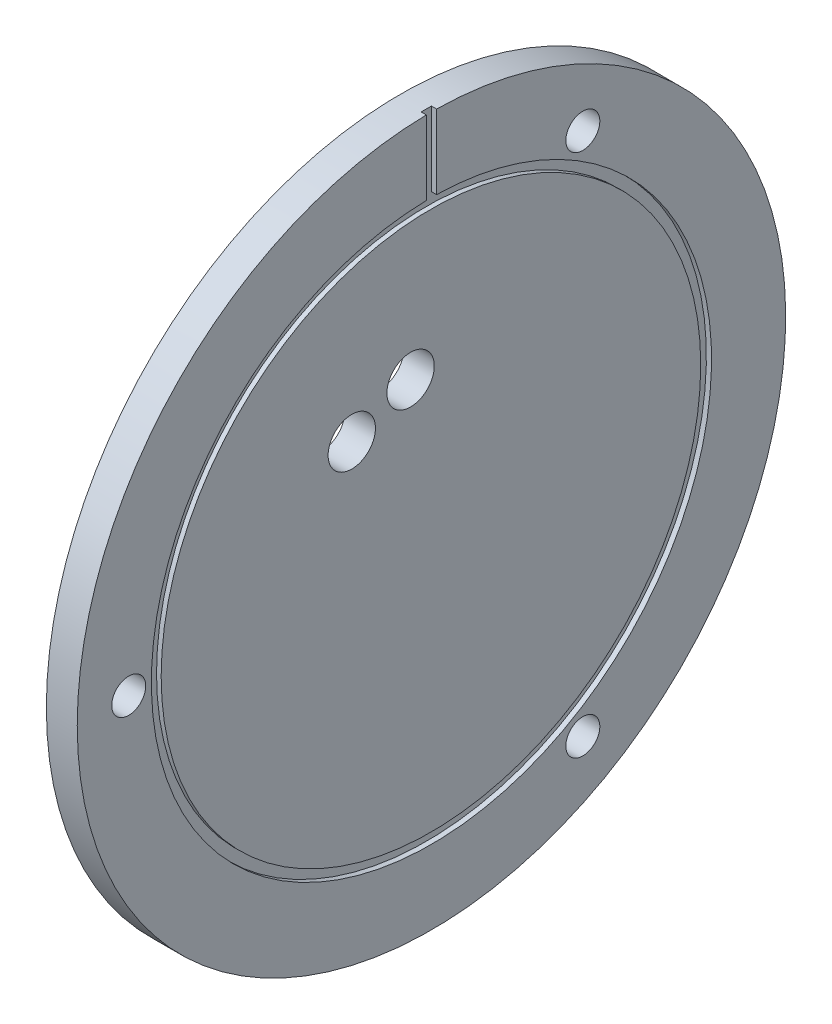
ISO-10303-21;
HEADER;
FILE_DESCRIPTION(('STEP AP214'),'2;1');
FILE_NAME('part.step','',(''),(''),'','','');
FILE_SCHEMA(('AUTOMOTIVE_DESIGN { 1 0 10303 214 1 1 1 1 }'));
ENDSEC;
DATA;
#1=APPLICATION_CONTEXT('core data for automotive mechanical design processes');
#2=APPLICATION_PROTOCOL_DEFINITION('international standard','automotive_design',2000,#1);
#3=PRODUCT_CONTEXT('',#1,'mechanical');
#4=PRODUCT('Part','Part','',(#3));
#5=PRODUCT_RELATED_PRODUCT_CATEGORY('part','',(#4));
#6=PRODUCT_DEFINITION_FORMATION('','',#4);
#7=PRODUCT_DEFINITION_CONTEXT('part definition',#1,'design');
#8=PRODUCT_DEFINITION('design','',#6,#7);
#9=PRODUCT_DEFINITION_SHAPE('','',#8);
#10=(LENGTH_UNIT() NAMED_UNIT(*) SI_UNIT(.MILLI.,.METRE.));
#11=(NAMED_UNIT(*) PLANE_ANGLE_UNIT() SI_UNIT($,.RADIAN.));
#12=(NAMED_UNIT(*) SI_UNIT($,.STERADIAN.) SOLID_ANGLE_UNIT());
#13=UNCERTAINTY_MEASURE_WITH_UNIT(LENGTH_MEASURE(1.E-05),#10,'distance_accuracy_value','');
#14=(GEOMETRIC_REPRESENTATION_CONTEXT(3) GLOBAL_UNCERTAINTY_ASSIGNED_CONTEXT((#13)) GLOBAL_UNIT_ASSIGNED_CONTEXT((#10,
#11,#12)) REPRESENTATION_CONTEXT('',''));
#15=CARTESIAN_POINT('',(0.,0.,0.));
#16=DIRECTION('',(0.,0.,1.));
#17=DIRECTION('',(1.,0.,0.));
#18=AXIS2_PLACEMENT_3D('',#15,#16,#17);
#19=CARTESIAN_POINT('',(-110.,0.,0.));
#20=DIRECTION('',(-1.,0.,0.));
#21=DIRECTION('',(0.,0.,1.));
#22=AXIS2_PLACEMENT_3D('',#19,#20,#21);
#23=CYLINDRICAL_SURFACE('',#22,27.2);
#24=DIRECTION('',(-1.,0.,0.));
#25=VECTOR('',#24,1.);
#26=CARTESIAN_POINT('',(-110.,27.1954040234743,-0.5));
#27=LINE('',#26,#25);
#28=CARTESIAN_POINT('',(159.2,27.1954040234743,-0.5));
#29=VERTEX_POINT('',#28);
#30=CARTESIAN_POINT('',(159.7,27.1954040234743,-0.5));
#31=VERTEX_POINT('',#30);
#32=EDGE_CURVE('E131',#29,#31,#27,.F.);
#33=ORIENTED_EDGE('',*,*,#32,.F.);
#34=CARTESIAN_POINT('',(159.2,0.,0.));
#35=DIRECTION('',(-1.,0.,0.));
#36=DIRECTION('',(0.,0.,1.));
#37=AXIS2_PLACEMENT_3D('',#34,#35,#36);
#38=CIRCLE('',#37,27.2);
#39=CARTESIAN_POINT('',(159.2,27.1954040234743,0.5));
#40=VERTEX_POINT('',#39);
#41=EDGE_CURVE('E105',#29,#40,#38,.T.);
#42=ORIENTED_EDGE('',*,*,#41,.T.);
#43=DIRECTION('',(-1.,0.,0.));
#44=VECTOR('',#43,1.);
#45=CARTESIAN_POINT('',(-110.,27.1954040234743,0.5));
#46=LINE('',#45,#44);
#47=CARTESIAN_POINT('',(159.7,27.1954040234743,0.5));
#48=VERTEX_POINT('',#47);
#49=EDGE_CURVE('E83',#48,#40,#46,.T.);
#50=ORIENTED_EDGE('',*,*,#49,.F.);
#51=CARTESIAN_POINT('',(159.7,0.,0.));
#52=DIRECTION('',(-1.,0.,0.));
#53=DIRECTION('',(0.,0.,1.));
#54=AXIS2_PLACEMENT_3D('',#51,#52,#53);
#55=CIRCLE('',#54,27.2);
#56=EDGE_CURVE('E107',#31,#48,#55,.T.);
#57=ORIENTED_EDGE('',*,*,#56,.F.);
#58=EDGE_LOOP('',(#33,#42,#50,#57));
#59=FACE_BOUND('',#58,.T.);
#60=ADVANCED_FACE('F33',(#59),#23,.F.);
#61=CARTESIAN_POINT('',(159.7,27.2,0.));
#62=DIRECTION('',(-1.,0.,0.));
#63=DIRECTION('',(0.,0.,1.));
#64=AXIS2_PLACEMENT_3D('',#61,#62,#63);
#65=PLANE('',#64);
#66=CARTESIAN_POINT('',(159.7,0.,29.4));
#67=DIRECTION('',(1.,0.,0.));
#68=DIRECTION('',(0.,0.,-1.));
#69=AXIS2_PLACEMENT_3D('',#66,#67,#68);
#70=CIRCLE('',#69,1.65);
#71=CARTESIAN_POINT('',(159.7,0.,27.75));
#72=VERTEX_POINT('',#71);
#73=EDGE_CURVE('E126',#72,#72,#70,.T.);
#74=ORIENTED_EDGE('',*,*,#73,.F.);
#75=EDGE_LOOP('',(#74));
#76=FACE_BOUND('',#75,.T.);
#77=CARTESIAN_POINT('',(159.7,-25.4611468712625,-14.7));
#78=DIRECTION('',(1.,0.,0.));
#79=DIRECTION('',(0.,0.,-1.));
#80=AXIS2_PLACEMENT_3D('',#77,#78,#79);
#81=CIRCLE('',#80,1.65);
#82=CARTESIAN_POINT('',(159.7,-25.4611468712625,-16.35));
#83=VERTEX_POINT('',#82);
#84=EDGE_CURVE('E130',#83,#83,#81,.T.);
#85=ORIENTED_EDGE('',*,*,#84,.F.);
#86=EDGE_LOOP('',(#85));
#87=FACE_BOUND('',#86,.T.);
#88=CARTESIAN_POINT('',(159.7,25.4611468712625,-14.7));
#89=DIRECTION('',(1.,0.,0.));
#90=DIRECTION('',(0.,0.,-1.));
#91=AXIS2_PLACEMENT_3D('',#88,#89,#90);
#92=CIRCLE('',#91,1.65);
#93=CARTESIAN_POINT('',(159.7,25.4611468712625,-16.35));
#94=VERTEX_POINT('',#93);
#95=EDGE_CURVE('E127',#94,#94,#92,.T.);
#96=ORIENTED_EDGE('',*,*,#95,.F.);
#97=EDGE_LOOP('',(#96));
#98=FACE_BOUND('',#97,.T.);
#99=DIRECTION('',(0.,1.,0.));
#100=VECTOR('',#99,1.);
#101=CARTESIAN_POINT('',(159.7,26.2,-0.5));
#102=LINE('',#101,#100);
#103=CARTESIAN_POINT('',(159.7,34.3963660871319,-0.5));
#104=VERTEX_POINT('',#103);
#105=EDGE_CURVE('E84',#31,#104,#102,.T.);
#106=ORIENTED_EDGE('',*,*,#105,.F.);
#107=ORIENTED_EDGE('',*,*,#56,.T.);
#108=DIRECTION('',(0.,-1.,0.));
#109=VECTOR('',#108,1.);
#110=CARTESIAN_POINT('',(159.7,35.,0.5));
#111=LINE('',#110,#109);
#112=CARTESIAN_POINT('',(159.7,34.3963660871319,0.5));
#113=VERTEX_POINT('',#112);
#114=EDGE_CURVE('E55',#113,#48,#111,.T.);
#115=ORIENTED_EDGE('',*,*,#114,.F.);
#116=CARTESIAN_POINT('',(159.7,0.,0.));
#117=DIRECTION('',(-1.,0.,0.));
#118=DIRECTION('',(0.,0.,1.));
#119=AXIS2_PLACEMENT_3D('',#116,#117,#118);
#120=CIRCLE('',#119,34.4);
#121=EDGE_CURVE('E89',#104,#113,#120,.T.);
#122=ORIENTED_EDGE('',*,*,#121,.F.);
#123=EDGE_LOOP('',(#106,#107,#115,#122));
#124=FACE_BOUND('',#123,.T.);
#125=ADVANCED_FACE('F146',(#76,#87,#98,#124),#65,.F.);
#126=CARTESIAN_POINT('',(-110.,0.,0.));
#127=DIRECTION('',(-1.,0.,0.));
#128=DIRECTION('',(0.,0.,1.));
#129=AXIS2_PLACEMENT_3D('',#126,#127,#128);
#130=CYLINDRICAL_SURFACE('',#129,34.4);
#131=CARTESIAN_POINT('',(156.7,0.,0.));
#132=DIRECTION('',(-1.,0.,0.));
#133=DIRECTION('',(0.,0.,1.));
#134=AXIS2_PLACEMENT_3D('',#131,#132,#133);
#135=CIRCLE('',#134,34.4);
#136=CARTESIAN_POINT('',(156.7,0.,34.4));
#137=VERTEX_POINT('',#136);
#138=EDGE_CURVE('E111',#137,#137,#135,.T.);
#139=ORIENTED_EDGE('',*,*,#138,.F.);
#140=EDGE_LOOP('',(#139));
#141=FACE_BOUND('',#140,.T.);
#142=DIRECTION('',(-1.,0.,0.));
#143=VECTOR('',#142,1.);
#144=CARTESIAN_POINT('',(-110.,34.3963660871319,-0.5));
#145=LINE('',#144,#143);
#146=CARTESIAN_POINT('',(159.2,34.3963660871319,-0.5));
#147=VERTEX_POINT('',#146);
#148=EDGE_CURVE('E11',#104,#147,#145,.T.);
#149=ORIENTED_EDGE('',*,*,#148,.F.);
#150=ORIENTED_EDGE('',*,*,#121,.T.);
#151=DIRECTION('',(-1.,0.,0.));
#152=VECTOR('',#151,1.);
#153=CARTESIAN_POINT('',(-110.,34.3963660871319,0.5));
#154=LINE('',#153,#152);
#155=CARTESIAN_POINT('',(159.2,34.3963660871319,0.5));
#156=VERTEX_POINT('',#155);
#157=EDGE_CURVE('E41',#156,#113,#154,.F.);
#158=ORIENTED_EDGE('',*,*,#157,.F.);
#159=CARTESIAN_POINT('',(159.2,0.,0.));
#160=DIRECTION('',(1.,0.,0.));
#161=DIRECTION('',(0.,0.,-1.));
#162=AXIS2_PLACEMENT_3D('',#159,#160,#161);
#163=CIRCLE('',#162,34.4);
#164=EDGE_CURVE('E72',#147,#156,#163,.T.);
#165=ORIENTED_EDGE('',*,*,#164,.F.);
#166=EDGE_LOOP('',(#149,#150,#158,#165));
#167=FACE_BOUND('',#166,.T.);
#168=ADVANCED_FACE('F87',(#141,#167),#130,.T.);
#169=CARTESIAN_POINT('',(156.7,34.4,0.));
#170=DIRECTION('',(1.,0.,0.));
#171=DIRECTION('',(0.,0.,-1.));
#172=AXIS2_PLACEMENT_3D('',#169,#170,#171);
#173=PLANE('',#172);
#174=CARTESIAN_POINT('',(156.7,25.4611468712625,-14.7));
#175=DIRECTION('',(1.,0.,0.));
#176=DIRECTION('',(0.,0.,-1.));
#177=AXIS2_PLACEMENT_3D('',#174,#175,#176);
#178=CIRCLE('',#177,1.65);
#179=CARTESIAN_POINT('',(156.7,25.4611468712625,-16.35));
#180=VERTEX_POINT('',#179);
#181=EDGE_CURVE('E99',#180,#180,#178,.F.);
#182=ORIENTED_EDGE('',*,*,#181,.F.);
#183=EDGE_LOOP('',(#182));
#184=FACE_BOUND('',#183,.T.);
#185=CARTESIAN_POINT('',(156.7,-25.4611468712625,-14.7));
#186=DIRECTION('',(1.,0.,0.));
#187=DIRECTION('',(0.,0.,-1.));
#188=AXIS2_PLACEMENT_3D('',#185,#186,#187);
#189=CIRCLE('',#188,1.65);
#190=CARTESIAN_POINT('',(156.7,-25.4611468712625,-16.35));
#191=VERTEX_POINT('',#190);
#192=EDGE_CURVE('E120',#191,#191,#189,.F.);
#193=ORIENTED_EDGE('',*,*,#192,.F.);
#194=EDGE_LOOP('',(#193));
#195=FACE_BOUND('',#194,.T.);
#196=CARTESIAN_POINT('',(156.7,0.,29.4));
#197=DIRECTION('',(1.,0.,0.));
#198=DIRECTION('',(0.,0.,-1.));
#199=AXIS2_PLACEMENT_3D('',#196,#197,#198);
#200=CIRCLE('',#199,1.65);
#201=CARTESIAN_POINT('',(156.7,0.,27.75));
#202=VERTEX_POINT('',#201);
#203=EDGE_CURVE('E123',#202,#202,#200,.F.);
#204=ORIENTED_EDGE('',*,*,#203,.F.);
#205=EDGE_LOOP('',(#204));
#206=FACE_BOUND('',#205,.T.);
#207=CARTESIAN_POINT('',(156.7,10.4836474229945,7.68720604058077));
#208=DIRECTION('',(1.,0.,0.));
#209=DIRECTION('',(0.,0.,-1.));
#210=AXIS2_PLACEMENT_3D('',#207,#208,#209);
#211=CIRCLE('',#210,2.3);
#212=CARTESIAN_POINT('',(156.7,10.4836474229945,5.38720604058077));
#213=VERTEX_POINT('',#212);
#214=EDGE_CURVE('E94',#213,#213,#211,.F.);
#215=ORIENTED_EDGE('',*,*,#214,.F.);
#216=EDGE_LOOP('',(#215));
#217=FACE_BOUND('',#216,.T.);
#218=CARTESIAN_POINT('',(156.7,12.8487337040411,1.97738266469541));
#219=DIRECTION('',(1.,0.,0.));
#220=DIRECTION('',(0.,0.,-1.));
#221=AXIS2_PLACEMENT_3D('',#218,#219,#220);
#222=CIRCLE('',#221,2.3);
#223=CARTESIAN_POINT('',(156.7,12.8487337040411,-0.322617335304591));
#224=VERTEX_POINT('',#223);
#225=EDGE_CURVE('E95',#224,#224,#222,.F.);
#226=ORIENTED_EDGE('',*,*,#225,.F.);
#227=EDGE_LOOP('',(#226));
#228=FACE_BOUND('',#227,.T.);
#229=ORIENTED_EDGE('',*,*,#138,.T.);
#230=EDGE_LOOP('',(#229));
#231=FACE_BOUND('',#230,.T.);
#232=ADVANCED_FACE('F35',(#184,#195,#206,#217,#228,#231),#173,.F.);
#233=CARTESIAN_POINT('',(159.65,0.,0.));
#234=DIRECTION('',(-1.,0.,0.));
#235=DIRECTION('',(0.,0.,1.));
#236=AXIS2_PLACEMENT_3D('',#233,#234,#235);
#237=PLANE('',#236);
#238=CARTESIAN_POINT('',(159.65,10.4836474229945,7.68720604058077));
#239=DIRECTION('',(-1.,0.,0.));
#240=DIRECTION('',(0.,0.,1.));
#241=AXIS2_PLACEMENT_3D('',#238,#239,#240);
#242=CIRCLE('',#241,2.3);
#243=CARTESIAN_POINT('',(159.65,10.4836474229945,9.98720604058077));
#244=VERTEX_POINT('',#243);
#245=EDGE_CURVE('E91',#244,#244,#242,.F.);
#246=ORIENTED_EDGE('',*,*,#245,.F.);
#247=EDGE_LOOP('',(#246));
#248=FACE_BOUND('',#247,.T.);
#249=CARTESIAN_POINT('',(159.65,12.8487337040411,1.97738266469541));
#250=DIRECTION('',(-1.,0.,0.));
#251=DIRECTION('',(0.,0.,1.));
#252=AXIS2_PLACEMENT_3D('',#249,#250,#251);
#253=CIRCLE('',#252,2.3);
#254=CARTESIAN_POINT('',(159.65,12.8487337040411,4.27738266469541));
#255=VERTEX_POINT('',#254);
#256=EDGE_CURVE('E96',#255,#255,#253,.F.);
#257=ORIENTED_EDGE('',*,*,#256,.F.);
#258=EDGE_LOOP('',(#257));
#259=FACE_BOUND('',#258,.T.);
#260=CARTESIAN_POINT('',(159.65,0.,0.));
#261=DIRECTION('',(-1.,0.,0.));
#262=DIRECTION('',(0.,0.,1.));
#263=AXIS2_PLACEMENT_3D('',#260,#261,#262);
#264=CIRCLE('',#263,26.2);
#265=CARTESIAN_POINT('',(159.65,0.,26.2));
#266=VERTEX_POINT('',#265);
#267=EDGE_CURVE('E80',#266,#266,#264,.T.);
#268=ORIENTED_EDGE('',*,*,#267,.F.);
#269=EDGE_LOOP('',(#268));
#270=FACE_BOUND('',#269,.T.);
#271=ADVANCED_FACE('F163',(#248,#259,#270),#237,.F.);
#272=CARTESIAN_POINT('',(-110.,0.,0.));
#273=DIRECTION('',(-1.,0.,0.));
#274=DIRECTION('',(0.,0.,1.));
#275=AXIS2_PLACEMENT_3D('',#272,#273,#274);
#276=CYLINDRICAL_SURFACE('',#275,26.2);
#277=CARTESIAN_POINT('',(159.2,0.,0.));
#278=DIRECTION('',(-1.,0.,0.));
#279=DIRECTION('',(0.,0.,1.));
#280=AXIS2_PLACEMENT_3D('',#277,#278,#279);
#281=CIRCLE('',#280,26.2);
#282=CARTESIAN_POINT('',(159.2,0.,26.2));
#283=VERTEX_POINT('',#282);
#284=EDGE_CURVE('E102',#283,#283,#281,.T.);
#285=ORIENTED_EDGE('',*,*,#284,.F.);
#286=EDGE_LOOP('',(#285));
#287=FACE_BOUND('',#286,.T.);
#288=ORIENTED_EDGE('',*,*,#267,.T.);
#289=EDGE_LOOP('',(#288));
#290=FACE_BOUND('',#289,.T.);
#291=ADVANCED_FACE('F160',(#287,#290),#276,.T.);
#292=CARTESIAN_POINT('',(159.2,26.2,0.));
#293=DIRECTION('',(-1.,0.,0.));
#294=DIRECTION('',(0.,0.,1.));
#295=AXIS2_PLACEMENT_3D('',#292,#293,#294);
#296=PLANE('',#295);
#297=ORIENTED_EDGE('',*,*,#284,.T.);
#298=EDGE_LOOP('',(#297));
#299=FACE_BOUND('',#298,.T.);
#300=ORIENTED_EDGE('',*,*,#41,.F.);
#301=DIRECTION('',(0.,1.,0.));
#302=VECTOR('',#301,1.);
#303=CARTESIAN_POINT('',(159.2,26.2,-0.5));
#304=LINE('',#303,#302);
#305=EDGE_CURVE('E48',#29,#147,#304,.T.);
#306=ORIENTED_EDGE('',*,*,#305,.T.);
#307=ORIENTED_EDGE('',*,*,#164,.T.);
#308=DIRECTION('',(0.,-1.,0.));
#309=VECTOR('',#308,1.);
#310=CARTESIAN_POINT('',(159.2,35.,0.5));
#311=LINE('',#310,#309);
#312=EDGE_CURVE('E75',#156,#40,#311,.T.);
#313=ORIENTED_EDGE('',*,*,#312,.T.);
#314=EDGE_LOOP('',(#300,#306,#307,#313));
#315=FACE_BOUND('',#314,.T.);
#316=ADVANCED_FACE('F74',(#299,#315),#296,.F.);
#317=CARTESIAN_POINT('',(159.7,0.,29.4));
#318=DIRECTION('',(-1.,0.,0.));
#319=DIRECTION('',(0.,0.,1.));
#320=AXIS2_PLACEMENT_3D('',#317,#318,#319);
#321=CYLINDRICAL_SURFACE('',#320,1.65);
#322=ORIENTED_EDGE('',*,*,#73,.T.);
#323=EDGE_LOOP('',(#322));
#324=FACE_BOUND('',#323,.T.);
#325=ORIENTED_EDGE('',*,*,#203,.T.);
#326=EDGE_LOOP('',(#325));
#327=FACE_BOUND('',#326,.T.);
#328=ADVANCED_FACE('F159',(#324,#327),#321,.F.);
#329=CARTESIAN_POINT('',(159.7,-25.4611468712625,-14.7));
#330=DIRECTION('',(-1.,0.,0.));
#331=DIRECTION('',(0.,0.,1.));
#332=AXIS2_PLACEMENT_3D('',#329,#330,#331);
#333=CYLINDRICAL_SURFACE('',#332,1.65);
#334=ORIENTED_EDGE('',*,*,#84,.T.);
#335=EDGE_LOOP('',(#334));
#336=FACE_BOUND('',#335,.T.);
#337=ORIENTED_EDGE('',*,*,#192,.T.);
#338=EDGE_LOOP('',(#337));
#339=FACE_BOUND('',#338,.T.);
#340=ADVANCED_FACE('F195',(#336,#339),#333,.F.);
#341=CARTESIAN_POINT('',(159.7,25.4611468712625,-14.7));
#342=DIRECTION('',(-1.,0.,0.));
#343=DIRECTION('',(0.,0.,1.));
#344=AXIS2_PLACEMENT_3D('',#341,#342,#343);
#345=CYLINDRICAL_SURFACE('',#344,1.65);
#346=ORIENTED_EDGE('',*,*,#95,.T.);
#347=EDGE_LOOP('',(#346));
#348=FACE_BOUND('',#347,.T.);
#349=ORIENTED_EDGE('',*,*,#181,.T.);
#350=EDGE_LOOP('',(#349));
#351=FACE_BOUND('',#350,.T.);
#352=ADVANCED_FACE('F182',(#348,#351),#345,.F.);
#353=CARTESIAN_POINT('',(159.7,12.8487337040411,1.97738266469541));
#354=DIRECTION('',(-1.,0.,0.));
#355=DIRECTION('',(0.,0.,1.));
#356=AXIS2_PLACEMENT_3D('',#353,#354,#355);
#357=CYLINDRICAL_SURFACE('',#356,2.3);
#358=ORIENTED_EDGE('',*,*,#256,.T.);
#359=EDGE_LOOP('',(#358));
#360=FACE_BOUND('',#359,.T.);
#361=ORIENTED_EDGE('',*,*,#225,.T.);
#362=EDGE_LOOP('',(#361));
#363=FACE_BOUND('',#362,.T.);
#364=ADVANCED_FACE('F178',(#360,#363),#357,.F.);
#365=CARTESIAN_POINT('',(159.7,10.4836474229945,7.68720604058077));
#366=DIRECTION('',(-1.,0.,0.));
#367=DIRECTION('',(0.,0.,1.));
#368=AXIS2_PLACEMENT_3D('',#365,#366,#367);
#369=CYLINDRICAL_SURFACE('',#368,2.3);
#370=ORIENTED_EDGE('',*,*,#245,.T.);
#371=EDGE_LOOP('',(#370));
#372=FACE_BOUND('',#371,.T.);
#373=ORIENTED_EDGE('',*,*,#214,.T.);
#374=EDGE_LOOP('',(#373));
#375=FACE_BOUND('',#374,.T.);
#376=ADVANCED_FACE('F181',(#372,#375),#369,.F.);
#377=CARTESIAN_POINT('',(159.7,26.2,-0.5));
#378=DIRECTION('',(0.,0.,1.));
#379=DIRECTION('',(1.,0.,0.));
#380=AXIS2_PLACEMENT_3D('',#377,#378,#379);
#381=PLANE('',#380);
#382=ORIENTED_EDGE('',*,*,#32,.T.);
#383=ORIENTED_EDGE('',*,*,#105,.T.);
#384=ORIENTED_EDGE('',*,*,#148,.T.);
#385=ORIENTED_EDGE('',*,*,#305,.F.);
#386=EDGE_LOOP('',(#382,#383,#384,#385));
#387=FACE_BOUND('',#386,.T.);
#388=ADVANCED_FACE('F142',(#387),#381,.T.);
#389=CARTESIAN_POINT('',(159.7,35.,0.5));
#390=DIRECTION('',(0.,0.,-1.));
#391=DIRECTION('',(-1.,0.,0.));
#392=AXIS2_PLACEMENT_3D('',#389,#390,#391);
#393=PLANE('',#392);
#394=ORIENTED_EDGE('',*,*,#49,.T.);
#395=ORIENTED_EDGE('',*,*,#312,.F.);
#396=ORIENTED_EDGE('',*,*,#157,.T.);
#397=ORIENTED_EDGE('',*,*,#114,.T.);
#398=EDGE_LOOP('',(#394,#395,#396,#397));
#399=FACE_BOUND('',#398,.T.);
#400=ADVANCED_FACE('F82',(#399),#393,.T.);
#401=CLOSED_SHELL('',(#60,#125,#168,#232,#271,#291,#316,#328,#340,#352,#364,#376,#388,#400));
#402=MANIFOLD_SOLID_BREP('B2',#401);
#403=ADVANCED_BREP_SHAPE_REPRESENTATION('',(#18,#402),#14);
#404=SHAPE_DEFINITION_REPRESENTATION(#9,#403);
ENDSEC;
END-ISO-10303-21;
